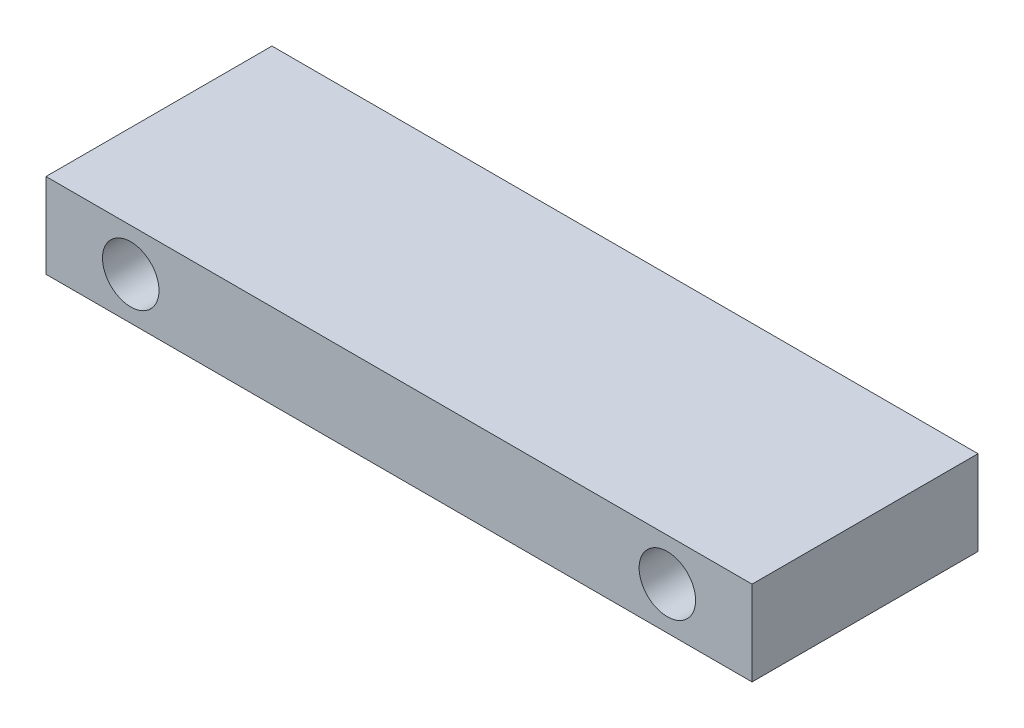
ISO-10303-21;
HEADER;
FILE_DESCRIPTION(('STEP AP214'),'2;1');
FILE_NAME('part.step','',(''),(''),'','','');
FILE_SCHEMA(('AUTOMOTIVE_DESIGN { 1 0 10303 214 1 1 1 1 }'));
ENDSEC;
DATA;
#1=APPLICATION_CONTEXT('core data for automotive mechanical design processes');
#2=APPLICATION_PROTOCOL_DEFINITION('international standard','automotive_design',2000,#1);
#3=PRODUCT_CONTEXT('',#1,'mechanical');
#4=PRODUCT('Part','Part','',(#3));
#5=PRODUCT_RELATED_PRODUCT_CATEGORY('part','',(#4));
#6=PRODUCT_DEFINITION_FORMATION('','',#4);
#7=PRODUCT_DEFINITION_CONTEXT('part definition',#1,'design');
#8=PRODUCT_DEFINITION('design','',#6,#7);
#9=PRODUCT_DEFINITION_SHAPE('','',#8);
#10=(LENGTH_UNIT() NAMED_UNIT(*) SI_UNIT(.MILLI.,.METRE.));
#11=(NAMED_UNIT(*) PLANE_ANGLE_UNIT() SI_UNIT($,.RADIAN.));
#12=(NAMED_UNIT(*) SI_UNIT($,.STERADIAN.) SOLID_ANGLE_UNIT());
#13=UNCERTAINTY_MEASURE_WITH_UNIT(LENGTH_MEASURE(1.E-05),#10,'distance_accuracy_value','');
#14=(GEOMETRIC_REPRESENTATION_CONTEXT(3) GLOBAL_UNCERTAINTY_ASSIGNED_CONTEXT((#13)) GLOBAL_UNIT_ASSIGNED_CONTEXT((#10,
#11,#12)) REPRESENTATION_CONTEXT('',''));
#15=CARTESIAN_POINT('',(0.,0.,0.));
#16=DIRECTION('',(0.,0.,1.));
#17=DIRECTION('',(1.,0.,0.));
#18=AXIS2_PLACEMENT_3D('',#15,#16,#17);
#19=CARTESIAN_POINT('',(0.,0.,8.));
#20=DIRECTION('',(0.,0.,-1.));
#21=DIRECTION('',(-1.,0.,0.));
#22=AXIS2_PLACEMENT_3D('',#19,#20,#21);
#23=PLANE('',#22);
#24=CARTESIAN_POINT('',(-90.1728156813344,33.8095392760613,8.));
#25=DIRECTION('',(0.,0.,1.));
#26=DIRECTION('',(1.,0.,0.));
#27=AXIS2_PLACEMENT_3D('',#24,#25,#26);
#28=CIRCLE('',#27,0.999999999999998);
#29=CARTESIAN_POINT('',(-89.1728156813344,33.8095392760613,8.));
#30=VERTEX_POINT('',#29);
#31=EDGE_CURVE('E100',#30,#30,#28,.T.);
#32=ORIENTED_EDGE('',*,*,#31,.F.);
#33=EDGE_LOOP('',(#32));
#34=FACE_BOUND('',#33,.T.);
#35=DIRECTION('',(0.,-1.,0.));
#36=VECTOR('',#35,1.);
#37=CARTESIAN_POINT('',(-93.1728156813344,32.3095392760613,8.));
#38=LINE('',#37,#36);
#39=CARTESIAN_POINT('',(-93.1728156813344,35.3095392760613,8.));
#40=VERTEX_POINT('',#39);
#41=CARTESIAN_POINT('',(-93.1728156813344,32.3095392760613,8.));
#42=VERTEX_POINT('',#41);
#43=EDGE_CURVE('E85',#40,#42,#38,.T.);
#44=ORIENTED_EDGE('',*,*,#43,.T.);
#45=DIRECTION('',(1.,0.,0.));
#46=VECTOR('',#45,1.);
#47=CARTESIAN_POINT('',(-68.1728156813344,32.3095392760613,8.));
#48=LINE('',#47,#46);
#49=CARTESIAN_POINT('',(-68.1728156813344,32.3095392760613,8.));
#50=VERTEX_POINT('',#49);
#51=EDGE_CURVE('E80',#42,#50,#48,.T.);
#52=ORIENTED_EDGE('',*,*,#51,.T.);
#53=DIRECTION('',(0.,1.,0.));
#54=VECTOR('',#53,1.);
#55=CARTESIAN_POINT('',(-68.1728156813344,35.3095392760613,8.));
#56=LINE('',#55,#54);
#57=CARTESIAN_POINT('',(-68.1728156813344,35.3095392760613,8.));
#58=VERTEX_POINT('',#57);
#59=EDGE_CURVE('E83',#50,#58,#56,.T.);
#60=ORIENTED_EDGE('',*,*,#59,.T.);
#61=DIRECTION('',(-1.,0.,0.));
#62=VECTOR('',#61,1.);
#63=CARTESIAN_POINT('',(-93.1728156813344,35.3095392760613,8.));
#64=LINE('',#63,#62);
#65=EDGE_CURVE('E50',#58,#40,#64,.T.);
#66=ORIENTED_EDGE('',*,*,#65,.T.);
#67=EDGE_LOOP('',(#44,#52,#60,#66));
#68=FACE_BOUND('',#67,.T.);
#69=CARTESIAN_POINT('',(-71.1728156813344,33.8095392760613,8.));
#70=DIRECTION('',(0.,0.,1.));
#71=DIRECTION('',(1.,0.,0.));
#72=AXIS2_PLACEMENT_3D('',#69,#70,#71);
#73=CIRCLE('',#72,0.999999999999998);
#74=CARTESIAN_POINT('',(-70.1728156813344,33.8095392760613,8.));
#75=VERTEX_POINT('',#74);
#76=EDGE_CURVE('E115',#75,#75,#73,.T.);
#77=ORIENTED_EDGE('',*,*,#76,.F.);
#78=EDGE_LOOP('',(#77));
#79=FACE_BOUND('',#78,.T.);
#80=ADVANCED_FACE('F33',(#34,#68,#79),#23,.F.);
#81=CARTESIAN_POINT('',(0.,0.,0.));
#82=DIRECTION('',(0.,0.,-1.));
#83=DIRECTION('',(-1.,0.,0.));
#84=AXIS2_PLACEMENT_3D('',#81,#82,#83);
#85=PLANE('',#84);
#86=CARTESIAN_POINT('',(-90.1728156813344,33.8095392760613,0.));
#87=DIRECTION('',(0.,0.,1.));
#88=DIRECTION('',(1.,0.,0.));
#89=AXIS2_PLACEMENT_3D('',#86,#87,#88);
#90=CIRCLE('',#89,0.999999999999998);
#91=CARTESIAN_POINT('',(-89.1728156813344,33.8095392760613,0.));
#92=VERTEX_POINT('',#91);
#93=EDGE_CURVE('E112',#92,#92,#90,.T.);
#94=ORIENTED_EDGE('',*,*,#93,.T.);
#95=EDGE_LOOP('',(#94));
#96=FACE_BOUND('',#95,.T.);
#97=DIRECTION('',(0.,-1.,0.));
#98=VECTOR('',#97,1.);
#99=CARTESIAN_POINT('',(-93.1728156813344,32.3095392760613,0.));
#100=LINE('',#99,#98);
#101=CARTESIAN_POINT('',(-93.1728156813344,35.3095392760613,0.));
#102=VERTEX_POINT('',#101);
#103=CARTESIAN_POINT('',(-93.1728156813344,32.3095392760613,0.));
#104=VERTEX_POINT('',#103);
#105=EDGE_CURVE('E97',#102,#104,#100,.T.);
#106=ORIENTED_EDGE('',*,*,#105,.F.);
#107=DIRECTION('',(-1.,0.,0.));
#108=VECTOR('',#107,1.);
#109=CARTESIAN_POINT('',(-93.1728156813344,35.3095392760613,0.));
#110=LINE('',#109,#108);
#111=CARTESIAN_POINT('',(-68.1728156813344,35.3095392760613,0.));
#112=VERTEX_POINT('',#111);
#113=EDGE_CURVE('E73',#112,#102,#110,.T.);
#114=ORIENTED_EDGE('',*,*,#113,.F.);
#115=DIRECTION('',(0.,1.,0.));
#116=VECTOR('',#115,1.);
#117=CARTESIAN_POINT('',(-68.1728156813344,35.3095392760613,0.));
#118=LINE('',#117,#116);
#119=CARTESIAN_POINT('',(-68.1728156813344,32.3095392760613,0.));
#120=VERTEX_POINT('',#119);
#121=EDGE_CURVE('E67',#120,#112,#118,.T.);
#122=ORIENTED_EDGE('',*,*,#121,.F.);
#123=DIRECTION('',(1.,0.,0.));
#124=VECTOR('',#123,1.);
#125=CARTESIAN_POINT('',(-68.1728156813344,32.3095392760613,0.));
#126=LINE('',#125,#124);
#127=EDGE_CURVE('E89',#104,#120,#126,.T.);
#128=ORIENTED_EDGE('',*,*,#127,.F.);
#129=EDGE_LOOP('',(#106,#114,#122,#128));
#130=FACE_BOUND('',#129,.T.);
#131=CARTESIAN_POINT('',(-71.1728156813344,33.8095392760613,0.));
#132=DIRECTION('',(0.,0.,1.));
#133=DIRECTION('',(1.,0.,0.));
#134=AXIS2_PLACEMENT_3D('',#131,#132,#133);
#135=CIRCLE('',#134,0.999999999999998);
#136=CARTESIAN_POINT('',(-70.1728156813344,33.8095392760613,0.));
#137=VERTEX_POINT('',#136);
#138=EDGE_CURVE('E118',#137,#137,#135,.T.);
#139=ORIENTED_EDGE('',*,*,#138,.T.);
#140=EDGE_LOOP('',(#139));
#141=FACE_BOUND('',#140,.T.);
#142=ADVANCED_FACE('F108',(#96,#130,#141),#85,.T.);
#143=CARTESIAN_POINT('',(-93.1728156813344,32.3095392760613,8.));
#144=DIRECTION('',(1.,0.,0.));
#145=DIRECTION('',(0.,0.,-1.));
#146=AXIS2_PLACEMENT_3D('',#143,#144,#145);
#147=PLANE('',#146);
#148=ORIENTED_EDGE('',*,*,#105,.T.);
#149=DIRECTION('',(0.,0.,-1.));
#150=VECTOR('',#149,1.);
#151=CARTESIAN_POINT('',(-93.1728156813344,32.3095392760613,8.));
#152=LINE('',#151,#150);
#153=EDGE_CURVE('E11',#42,#104,#152,.T.);
#154=ORIENTED_EDGE('',*,*,#153,.F.);
#155=ORIENTED_EDGE('',*,*,#43,.F.);
#156=DIRECTION('',(0.,0.,-1.));
#157=VECTOR('',#156,1.);
#158=CARTESIAN_POINT('',(-93.1728156813344,35.3095392760613,8.));
#159=LINE('',#158,#157);
#160=EDGE_CURVE('E93',#40,#102,#159,.T.);
#161=ORIENTED_EDGE('',*,*,#160,.T.);
#162=EDGE_LOOP('',(#148,#154,#155,#161));
#163=FACE_BOUND('',#162,.T.);
#164=ADVANCED_FACE('F35',(#163),#147,.F.);
#165=CARTESIAN_POINT('',(-68.1728156813344,32.3095392760613,8.));
#166=DIRECTION('',(0.,1.,0.));
#167=DIRECTION('',(0.,0.,1.));
#168=AXIS2_PLACEMENT_3D('',#165,#166,#167);
#169=PLANE('',#168);
#170=ORIENTED_EDGE('',*,*,#127,.T.);
#171=DIRECTION('',(0.,0.,-1.));
#172=VECTOR('',#171,1.);
#173=CARTESIAN_POINT('',(-68.1728156813344,32.3095392760613,8.));
#174=LINE('',#173,#172);
#175=EDGE_CURVE('E42',#50,#120,#174,.T.);
#176=ORIENTED_EDGE('',*,*,#175,.F.);
#177=ORIENTED_EDGE('',*,*,#51,.F.);
#178=ORIENTED_EDGE('',*,*,#153,.T.);
#179=EDGE_LOOP('',(#170,#176,#177,#178));
#180=FACE_BOUND('',#179,.T.);
#181=ADVANCED_FACE('F88',(#180),#169,.F.);
#182=CARTESIAN_POINT('',(-68.1728156813344,35.3095392760613,8.));
#183=DIRECTION('',(-1.,0.,0.));
#184=DIRECTION('',(0.,0.,1.));
#185=AXIS2_PLACEMENT_3D('',#182,#183,#184);
#186=PLANE('',#185);
#187=ORIENTED_EDGE('',*,*,#121,.T.);
#188=DIRECTION('',(0.,0.,-1.));
#189=VECTOR('',#188,1.);
#190=CARTESIAN_POINT('',(-68.1728156813344,35.3095392760613,8.));
#191=LINE('',#190,#189);
#192=EDGE_CURVE('E90',#58,#112,#191,.T.);
#193=ORIENTED_EDGE('',*,*,#192,.F.);
#194=ORIENTED_EDGE('',*,*,#59,.F.);
#195=ORIENTED_EDGE('',*,*,#175,.T.);
#196=EDGE_LOOP('',(#187,#193,#194,#195));
#197=FACE_BOUND('',#196,.T.);
#198=ADVANCED_FACE('F91',(#197),#186,.F.);
#199=CARTESIAN_POINT('',(-93.1728156813344,35.3095392760613,8.));
#200=DIRECTION('',(0.,-1.,0.));
#201=DIRECTION('',(0.,0.,-1.));
#202=AXIS2_PLACEMENT_3D('',#199,#200,#201);
#203=PLANE('',#202);
#204=ORIENTED_EDGE('',*,*,#113,.T.);
#205=ORIENTED_EDGE('',*,*,#160,.F.);
#206=ORIENTED_EDGE('',*,*,#65,.F.);
#207=ORIENTED_EDGE('',*,*,#192,.T.);
#208=EDGE_LOOP('',(#204,#205,#206,#207));
#209=FACE_BOUND('',#208,.T.);
#210=ADVANCED_FACE('F105',(#209),#203,.F.);
#211=CARTESIAN_POINT('',(-90.1728156813344,33.8095392760613,8.));
#212=DIRECTION('',(0.,0.,-1.));
#213=DIRECTION('',(-1.,0.,0.));
#214=AXIS2_PLACEMENT_3D('',#211,#212,#213);
#215=CYLINDRICAL_SURFACE('',#214,0.999999999999998);
#216=ORIENTED_EDGE('',*,*,#31,.T.);
#217=EDGE_LOOP('',(#216));
#218=FACE_BOUND('',#217,.T.);
#219=ORIENTED_EDGE('',*,*,#93,.F.);
#220=EDGE_LOOP('',(#219));
#221=FACE_BOUND('',#220,.T.);
#222=ADVANCED_FACE('F136',(#218,#221),#215,.F.);
#223=CARTESIAN_POINT('',(-71.1728156813344,33.8095392760613,8.));
#224=DIRECTION('',(0.,0.,-1.));
#225=DIRECTION('',(-1.,0.,0.));
#226=AXIS2_PLACEMENT_3D('',#223,#224,#225);
#227=CYLINDRICAL_SURFACE('',#226,0.999999999999998);
#228=ORIENTED_EDGE('',*,*,#76,.T.);
#229=EDGE_LOOP('',(#228));
#230=FACE_BOUND('',#229,.T.);
#231=ORIENTED_EDGE('',*,*,#138,.F.);
#232=EDGE_LOOP('',(#231));
#233=FACE_BOUND('',#232,.T.);
#234=ADVANCED_FACE('F124',(#230,#233),#227,.F.);
#235=CLOSED_SHELL('',(#80,#142,#164,#181,#198,#210,#222,#234));
#236=MANIFOLD_SOLID_BREP('B2',#235);
#237=ADVANCED_BREP_SHAPE_REPRESENTATION('',(#18,#236),#14);
#238=SHAPE_DEFINITION_REPRESENTATION(#9,#237);
ENDSEC;
END-ISO-10303-21;
